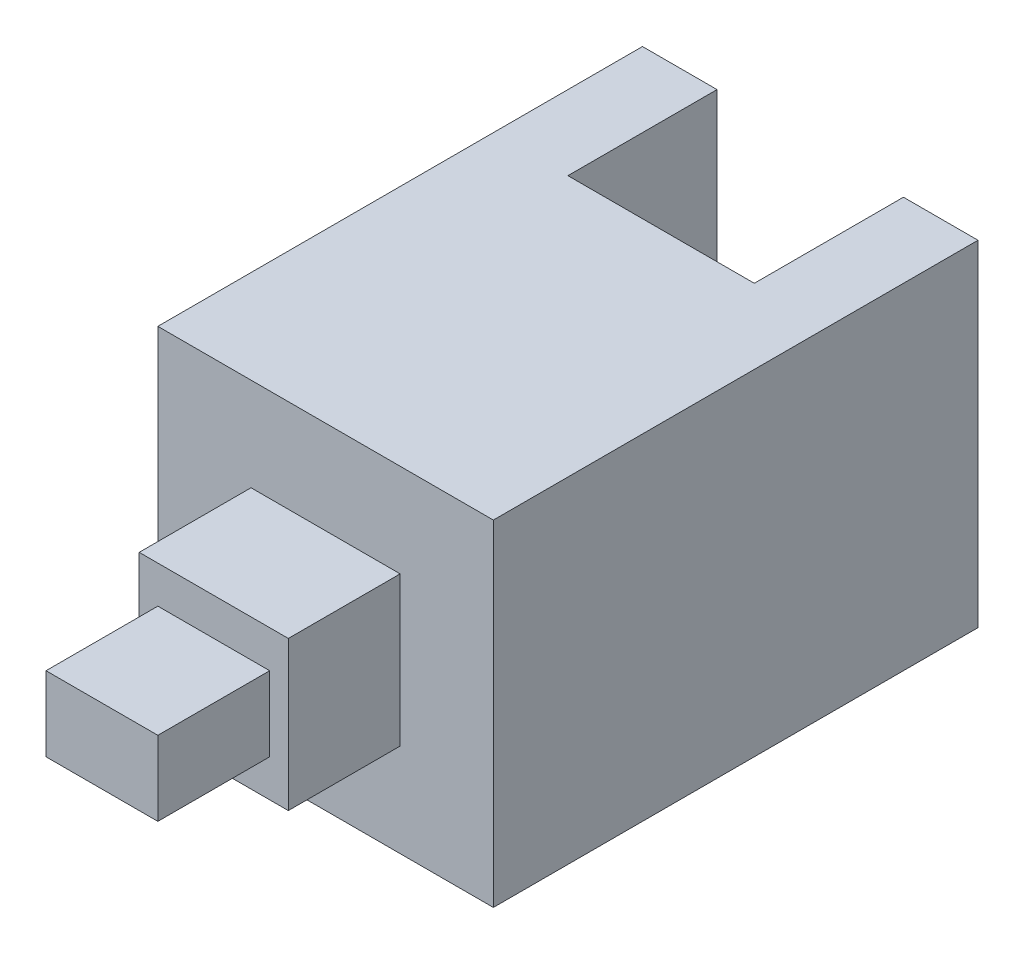
ISO-10303-21;
HEADER;
FILE_DESCRIPTION(('STEP AP214'),'2;1');
FILE_NAME('part.step','',(''),(''),'','','');
FILE_SCHEMA(('AUTOMOTIVE_DESIGN { 1 0 10303 214 1 1 1 1 }'));
ENDSEC;
DATA;
#1=APPLICATION_CONTEXT('core data for automotive mechanical design processes');
#2=APPLICATION_PROTOCOL_DEFINITION('international standard','automotive_design',2000,#1);
#3=PRODUCT_CONTEXT('',#1,'mechanical');
#4=PRODUCT('Part','Part','',(#3));
#5=PRODUCT_RELATED_PRODUCT_CATEGORY('part','',(#4));
#6=PRODUCT_DEFINITION_FORMATION('','',#4);
#7=PRODUCT_DEFINITION_CONTEXT('part definition',#1,'design');
#8=PRODUCT_DEFINITION('design','',#6,#7);
#9=PRODUCT_DEFINITION_SHAPE('','',#8);
#10=(LENGTH_UNIT() NAMED_UNIT(*) SI_UNIT(.MILLI.,.METRE.));
#11=(NAMED_UNIT(*) PLANE_ANGLE_UNIT() SI_UNIT($,.RADIAN.));
#12=(NAMED_UNIT(*) SI_UNIT($,.STERADIAN.) SOLID_ANGLE_UNIT());
#13=UNCERTAINTY_MEASURE_WITH_UNIT(LENGTH_MEASURE(1.E-05),#10,'distance_accuracy_value','');
#14=(GEOMETRIC_REPRESENTATION_CONTEXT(3) GLOBAL_UNCERTAINTY_ASSIGNED_CONTEXT((#13)) GLOBAL_UNIT_ASSIGNED_CONTEXT((#10,
#11,#12)) REPRESENTATION_CONTEXT('',''));
#15=CARTESIAN_POINT('',(0.,0.,0.));
#16=DIRECTION('',(0.,0.,1.));
#17=DIRECTION('',(1.,0.,0.));
#18=AXIS2_PLACEMENT_3D('',#15,#16,#17);
#19=CARTESIAN_POINT('',(0.,0.,0.));
#20=DIRECTION('',(0.,0.,1.));
#21=DIRECTION('',(1.,0.,0.));
#22=AXIS2_PLACEMENT_3D('',#19,#20,#21);
#23=PLANE('',#22);
#24=DIRECTION('',(0.,-1.,0.));
#25=VECTOR('',#24,1.);
#26=CARTESIAN_POINT('',(-2.5,4.5,0.));
#27=LINE('',#26,#25);
#28=CARTESIAN_POINT('',(-2.5,4.5,0.));
#29=VERTEX_POINT('',#28);
#30=CARTESIAN_POINT('',(-2.5,-4.5,0.));
#31=VERTEX_POINT('',#30);
#32=EDGE_CURVE('E177',#29,#31,#27,.T.);
#33=ORIENTED_EDGE('',*,*,#32,.F.);
#34=DIRECTION('',(-1.,0.,0.));
#35=VECTOR('',#34,1.);
#36=CARTESIAN_POINT('',(-4.5,4.5,0.));
#37=LINE('',#36,#35);
#38=CARTESIAN_POINT('',(2.5,4.5,0.));
#39=VERTEX_POINT('',#38);
#40=EDGE_CURVE('E306',#39,#29,#37,.T.);
#41=ORIENTED_EDGE('',*,*,#40,.F.);
#42=DIRECTION('',(0.,1.,0.));
#43=VECTOR('',#42,1.);
#44=CARTESIAN_POINT('',(2.5,4.5,0.));
#45=LINE('',#44,#43);
#46=CARTESIAN_POINT('',(2.5,-4.5,0.));
#47=VERTEX_POINT('',#46);
#48=EDGE_CURVE('E190',#47,#39,#45,.T.);
#49=ORIENTED_EDGE('',*,*,#48,.F.);
#50=DIRECTION('',(1.,0.,0.));
#51=VECTOR('',#50,1.);
#52=CARTESIAN_POINT('',(-4.5,-4.5,0.));
#53=LINE('',#52,#51);
#54=EDGE_CURVE('E60',#31,#47,#53,.T.);
#55=ORIENTED_EDGE('',*,*,#54,.F.);
#56=EDGE_LOOP('',(#33,#41,#49,#55));
#57=FACE_BOUND('',#56,.T.);
#58=ADVANCED_FACE('F39',(#57),#23,.F.);
#59=CARTESIAN_POINT('',(4.5,4.5,9.));
#60=DIRECTION('',(-1.,0.,0.));
#61=DIRECTION('',(0.,-1.,0.));
#62=AXIS2_PLACEMENT_3D('',#59,#60,#61);
#63=PLANE('',#62);
#64=DIRECTION('',(0.,0.,-1.));
#65=VECTOR('',#64,1.);
#66=CARTESIAN_POINT('',(4.5,-4.5,9.));
#67=LINE('',#66,#65);
#68=CARTESIAN_POINT('',(4.5,-4.5,9.));
#69=VERTEX_POINT('',#68);
#70=CARTESIAN_POINT('',(4.5,-4.5,-4.));
#71=VERTEX_POINT('',#70);
#72=EDGE_CURVE('E319',#69,#71,#67,.T.);
#73=ORIENTED_EDGE('',*,*,#72,.T.);
#74=DIRECTION('',(0.,-1.,0.));
#75=VECTOR('',#74,1.);
#76=CARTESIAN_POINT('',(4.5,4.5,-4.));
#77=LINE('',#76,#75);
#78=CARTESIAN_POINT('',(4.5,4.5,-4.));
#79=VERTEX_POINT('',#78);
#80=EDGE_CURVE('E191',#79,#71,#77,.T.);
#81=ORIENTED_EDGE('',*,*,#80,.F.);
#82=DIRECTION('',(0.,0.,-1.));
#83=VECTOR('',#82,1.);
#84=CARTESIAN_POINT('',(4.5,4.5,9.));
#85=LINE('',#84,#83);
#86=CARTESIAN_POINT('',(4.5,4.5,9.));
#87=VERTEX_POINT('',#86);
#88=EDGE_CURVE('E11',#87,#79,#85,.T.);
#89=ORIENTED_EDGE('',*,*,#88,.F.);
#90=DIRECTION('',(0.,1.,0.));
#91=VECTOR('',#90,1.);
#92=CARTESIAN_POINT('',(4.5,4.5,9.));
#93=LINE('',#92,#91);
#94=EDGE_CURVE('E307',#69,#87,#93,.T.);
#95=ORIENTED_EDGE('',*,*,#94,.F.);
#96=EDGE_LOOP('',(#73,#81,#89,#95));
#97=FACE_BOUND('',#96,.T.);
#98=ADVANCED_FACE('F41',(#97),#63,.F.);
#99=CARTESIAN_POINT('',(-4.5,4.5,9.));
#100=DIRECTION('',(0.,-1.,0.));
#101=DIRECTION('',(0.,0.,-1.));
#102=AXIS2_PLACEMENT_3D('',#99,#100,#101);
#103=PLANE('',#102);
#104=ORIENTED_EDGE('',*,*,#88,.T.);
#105=DIRECTION('',(1.,0.,0.));
#106=VECTOR('',#105,1.);
#107=CARTESIAN_POINT('',(4.5,4.5,-4.));
#108=LINE('',#107,#106);
#109=CARTESIAN_POINT('',(2.5,4.5,-4.));
#110=VERTEX_POINT('',#109);
#111=EDGE_CURVE('E201',#110,#79,#108,.T.);
#112=ORIENTED_EDGE('',*,*,#111,.F.);
#113=DIRECTION('',(0.,0.,1.));
#114=VECTOR('',#113,1.);
#115=CARTESIAN_POINT('',(2.5,4.5,-4.));
#116=LINE('',#115,#114);
#117=EDGE_CURVE('E205',#110,#39,#116,.T.);
#118=ORIENTED_EDGE('',*,*,#117,.T.);
#119=ORIENTED_EDGE('',*,*,#40,.T.);
#120=DIRECTION('',(0.,0.,1.));
#121=VECTOR('',#120,1.);
#122=CARTESIAN_POINT('',(-2.5,4.5,-4.));
#123=LINE('',#122,#121);
#124=CARTESIAN_POINT('',(-2.5,4.5,-4.));
#125=VERTEX_POINT('',#124);
#126=EDGE_CURVE('E167',#125,#29,#123,.T.);
#127=ORIENTED_EDGE('',*,*,#126,.F.);
#128=DIRECTION('',(1.,0.,0.));
#129=VECTOR('',#128,1.);
#130=CARTESIAN_POINT('',(-4.5,4.5,-4.));
#131=LINE('',#130,#129);
#132=CARTESIAN_POINT('',(-4.5,4.5,-4.));
#133=VERTEX_POINT('',#132);
#134=EDGE_CURVE('E164',#133,#125,#131,.T.);
#135=ORIENTED_EDGE('',*,*,#134,.F.);
#136=DIRECTION('',(0.,0.,-1.));
#137=VECTOR('',#136,1.);
#138=CARTESIAN_POINT('',(-4.5,4.5,9.));
#139=LINE('',#138,#137);
#140=CARTESIAN_POINT('',(-4.5,4.5,9.));
#141=VERTEX_POINT('',#140);
#142=EDGE_CURVE('E48',#141,#133,#139,.T.);
#143=ORIENTED_EDGE('',*,*,#142,.F.);
#144=DIRECTION('',(-1.,0.,0.));
#145=VECTOR('',#144,1.);
#146=CARTESIAN_POINT('',(-4.5,4.5,9.));
#147=LINE('',#146,#145);
#148=EDGE_CURVE('E311',#87,#141,#147,.T.);
#149=ORIENTED_EDGE('',*,*,#148,.F.);
#150=EDGE_LOOP('',(#104,#112,#118,#119,#127,#135,#143,#149));
#151=FACE_BOUND('',#150,.T.);
#152=ADVANCED_FACE('F165',(#151),#103,.F.);
#153=CARTESIAN_POINT('',(-4.5,4.5,9.));
#154=DIRECTION('',(1.,0.,0.));
#155=DIRECTION('',(0.,1.,0.));
#156=AXIS2_PLACEMENT_3D('',#153,#154,#155);
#157=PLANE('',#156);
#158=ORIENTED_EDGE('',*,*,#142,.T.);
#159=DIRECTION('',(0.,1.,0.));
#160=VECTOR('',#159,1.);
#161=CARTESIAN_POINT('',(-4.5,4.5,-4.));
#162=LINE('',#161,#160);
#163=CARTESIAN_POINT('',(-4.5,-4.5,-4.));
#164=VERTEX_POINT('',#163);
#165=EDGE_CURVE('E158',#164,#133,#162,.T.);
#166=ORIENTED_EDGE('',*,*,#165,.F.);
#167=DIRECTION('',(0.,0.,-1.));
#168=VECTOR('',#167,1.);
#169=CARTESIAN_POINT('',(-4.5,-4.5,9.));
#170=LINE('',#169,#168);
#171=CARTESIAN_POINT('',(-4.5,-4.5,9.));
#172=VERTEX_POINT('',#171);
#173=EDGE_CURVE('E162',#172,#164,#170,.T.);
#174=ORIENTED_EDGE('',*,*,#173,.F.);
#175=DIRECTION('',(0.,-1.,0.));
#176=VECTOR('',#175,1.);
#177=CARTESIAN_POINT('',(-4.5,4.5,9.));
#178=LINE('',#177,#176);
#179=EDGE_CURVE('E159',#141,#172,#178,.T.);
#180=ORIENTED_EDGE('',*,*,#179,.F.);
#181=EDGE_LOOP('',(#158,#166,#174,#180));
#182=FACE_BOUND('',#181,.T.);
#183=ADVANCED_FACE('F155',(#182),#157,.F.);
#184=CARTESIAN_POINT('',(-4.5,-4.5,9.));
#185=DIRECTION('',(0.,1.,0.));
#186=DIRECTION('',(0.,0.,1.));
#187=AXIS2_PLACEMENT_3D('',#184,#185,#186);
#188=PLANE('',#187);
#189=ORIENTED_EDGE('',*,*,#173,.T.);
#190=DIRECTION('',(-1.,0.,0.));
#191=VECTOR('',#190,1.);
#192=CARTESIAN_POINT('',(-4.5,-4.5,-4.));
#193=LINE('',#192,#191);
#194=CARTESIAN_POINT('',(-2.5,-4.5,-4.));
#195=VERTEX_POINT('',#194);
#196=EDGE_CURVE('E175',#195,#164,#193,.T.);
#197=ORIENTED_EDGE('',*,*,#196,.F.);
#198=DIRECTION('',(0.,0.,1.));
#199=VECTOR('',#198,1.);
#200=CARTESIAN_POINT('',(-2.5,-4.5,-4.));
#201=LINE('',#200,#199);
#202=EDGE_CURVE('E55',#195,#31,#201,.T.);
#203=ORIENTED_EDGE('',*,*,#202,.T.);
#204=ORIENTED_EDGE('',*,*,#54,.T.);
#205=DIRECTION('',(0.,0.,1.));
#206=VECTOR('',#205,1.);
#207=CARTESIAN_POINT('',(2.5,-4.5,-4.));
#208=LINE('',#207,#206);
#209=CARTESIAN_POINT('',(2.5,-4.5,-4.));
#210=VERTEX_POINT('',#209);
#211=EDGE_CURVE('E212',#210,#47,#208,.T.);
#212=ORIENTED_EDGE('',*,*,#211,.F.);
#213=DIRECTION('',(-1.,0.,0.));
#214=VECTOR('',#213,1.);
#215=CARTESIAN_POINT('',(4.5,-4.5,-4.));
#216=LINE('',#215,#214);
#217=EDGE_CURVE('E195',#71,#210,#216,.T.);
#218=ORIENTED_EDGE('',*,*,#217,.F.);
#219=ORIENTED_EDGE('',*,*,#72,.F.);
#220=DIRECTION('',(1.,0.,0.));
#221=VECTOR('',#220,1.);
#222=CARTESIAN_POINT('',(-4.5,-4.5,9.));
#223=LINE('',#222,#221);
#224=EDGE_CURVE('E316',#172,#69,#223,.T.);
#225=ORIENTED_EDGE('',*,*,#224,.F.);
#226=EDGE_LOOP('',(#189,#197,#203,#204,#212,#218,#219,#225));
#227=FACE_BOUND('',#226,.T.);
#228=ADVANCED_FACE('F328',(#227),#188,.F.);
#229=CARTESIAN_POINT('',(0.,0.,9.));
#230=DIRECTION('',(0.,0.,1.));
#231=DIRECTION('',(1.,0.,0.));
#232=AXIS2_PLACEMENT_3D('',#229,#230,#231);
#233=PLANE('',#232);
#234=DIRECTION('',(0.,1.,0.));
#235=VECTOR('',#234,1.);
#236=CARTESIAN_POINT('',(2.,2.,9.));
#237=LINE('',#236,#235);
#238=CARTESIAN_POINT('',(2.,-2.,9.));
#239=VERTEX_POINT('',#238);
#240=CARTESIAN_POINT('',(2.,2.,9.));
#241=VERTEX_POINT('',#240);
#242=EDGE_CURVE('E261',#239,#241,#237,.T.);
#243=ORIENTED_EDGE('',*,*,#242,.F.);
#244=DIRECTION('',(1.,0.,0.));
#245=VECTOR('',#244,1.);
#246=CARTESIAN_POINT('',(-2.,-2.,9.));
#247=LINE('',#246,#245);
#248=CARTESIAN_POINT('',(-2.,-2.,9.));
#249=VERTEX_POINT('',#248);
#250=EDGE_CURVE('E267',#249,#239,#247,.T.);
#251=ORIENTED_EDGE('',*,*,#250,.F.);
#252=DIRECTION('',(0.,-1.,0.));
#253=VECTOR('',#252,1.);
#254=CARTESIAN_POINT('',(-2.,2.,9.));
#255=LINE('',#254,#253);
#256=CARTESIAN_POINT('',(-2.,2.,9.));
#257=VERTEX_POINT('',#256);
#258=EDGE_CURVE('E284',#257,#249,#255,.T.);
#259=ORIENTED_EDGE('',*,*,#258,.F.);
#260=DIRECTION('',(-1.,0.,0.));
#261=VECTOR('',#260,1.);
#262=CARTESIAN_POINT('',(-2.,2.,9.));
#263=LINE('',#262,#261);
#264=EDGE_CURVE('E280',#241,#257,#263,.T.);
#265=ORIENTED_EDGE('',*,*,#264,.F.);
#266=EDGE_LOOP('',(#243,#251,#259,#265));
#267=FACE_BOUND('',#266,.T.);
#268=ORIENTED_EDGE('',*,*,#94,.T.);
#269=ORIENTED_EDGE('',*,*,#148,.T.);
#270=ORIENTED_EDGE('',*,*,#179,.T.);
#271=ORIENTED_EDGE('',*,*,#224,.T.);
#272=EDGE_LOOP('',(#268,#269,#270,#271));
#273=FACE_BOUND('',#272,.T.);
#274=ADVANCED_FACE('F333',(#267,#273),#233,.T.);
#275=CARTESIAN_POINT('',(2.,2.,12.));
#276=DIRECTION('',(-1.,0.,0.));
#277=DIRECTION('',(0.,-1.,0.));
#278=AXIS2_PLACEMENT_3D('',#275,#276,#277);
#279=PLANE('',#278);
#280=ORIENTED_EDGE('',*,*,#242,.T.);
#281=DIRECTION('',(0.,0.,-1.));
#282=VECTOR('',#281,1.);
#283=CARTESIAN_POINT('',(2.,2.,12.));
#284=LINE('',#283,#282);
#285=CARTESIAN_POINT('',(2.,2.,12.));
#286=VERTEX_POINT('',#285);
#287=EDGE_CURVE('E302',#286,#241,#284,.T.);
#288=ORIENTED_EDGE('',*,*,#287,.F.);
#289=DIRECTION('',(0.,1.,0.));
#290=VECTOR('',#289,1.);
#291=CARTESIAN_POINT('',(2.,2.,12.));
#292=LINE('',#291,#290);
#293=CARTESIAN_POINT('',(2.,-2.,12.));
#294=VERTEX_POINT('',#293);
#295=EDGE_CURVE('E262',#294,#286,#292,.T.);
#296=ORIENTED_EDGE('',*,*,#295,.F.);
#297=DIRECTION('',(0.,0.,-1.));
#298=VECTOR('',#297,1.);
#299=CARTESIAN_POINT('',(2.,-2.,12.));
#300=LINE('',#299,#298);
#301=EDGE_CURVE('E276',#294,#239,#300,.T.);
#302=ORIENTED_EDGE('',*,*,#301,.T.);
#303=EDGE_LOOP('',(#280,#288,#296,#302));
#304=FACE_BOUND('',#303,.T.);
#305=ADVANCED_FACE('F387',(#304),#279,.F.);
#306=CARTESIAN_POINT('',(-2.,2.,12.));
#307=DIRECTION('',(0.,-1.,0.));
#308=DIRECTION('',(0.,0.,-1.));
#309=AXIS2_PLACEMENT_3D('',#306,#307,#308);
#310=PLANE('',#309);
#311=ORIENTED_EDGE('',*,*,#264,.T.);
#312=DIRECTION('',(0.,0.,-1.));
#313=VECTOR('',#312,1.);
#314=CARTESIAN_POINT('',(-2.,2.,12.));
#315=LINE('',#314,#313);
#316=CARTESIAN_POINT('',(-2.,2.,12.));
#317=VERTEX_POINT('',#316);
#318=EDGE_CURVE('E298',#317,#257,#315,.T.);
#319=ORIENTED_EDGE('',*,*,#318,.F.);
#320=DIRECTION('',(-1.,0.,0.));
#321=VECTOR('',#320,1.);
#322=CARTESIAN_POINT('',(-2.,2.,12.));
#323=LINE('',#322,#321);
#324=EDGE_CURVE('E266',#286,#317,#323,.T.);
#325=ORIENTED_EDGE('',*,*,#324,.F.);
#326=ORIENTED_EDGE('',*,*,#287,.T.);
#327=EDGE_LOOP('',(#311,#319,#325,#326));
#328=FACE_BOUND('',#327,.T.);
#329=ADVANCED_FACE('F394',(#328),#310,.F.);
#330=CARTESIAN_POINT('',(-2.,2.,12.));
#331=DIRECTION('',(1.,0.,0.));
#332=DIRECTION('',(0.,1.,0.));
#333=AXIS2_PLACEMENT_3D('',#330,#331,#332);
#334=PLANE('',#333);
#335=ORIENTED_EDGE('',*,*,#258,.T.);
#336=DIRECTION('',(0.,0.,-1.));
#337=VECTOR('',#336,1.);
#338=CARTESIAN_POINT('',(-2.,-2.,12.));
#339=LINE('',#338,#337);
#340=CARTESIAN_POINT('',(-2.,-2.,12.));
#341=VERTEX_POINT('',#340);
#342=EDGE_CURVE('E294',#341,#249,#339,.T.);
#343=ORIENTED_EDGE('',*,*,#342,.F.);
#344=DIRECTION('',(0.,-1.,0.));
#345=VECTOR('',#344,1.);
#346=CARTESIAN_POINT('',(-2.,2.,12.));
#347=LINE('',#346,#345);
#348=EDGE_CURVE('E270',#317,#341,#347,.T.);
#349=ORIENTED_EDGE('',*,*,#348,.F.);
#350=ORIENTED_EDGE('',*,*,#318,.T.);
#351=EDGE_LOOP('',(#335,#343,#349,#350));
#352=FACE_BOUND('',#351,.T.);
#353=ADVANCED_FACE('F401',(#352),#334,.F.);
#354=CARTESIAN_POINT('',(-2.,-2.,12.));
#355=DIRECTION('',(0.,1.,0.));
#356=DIRECTION('',(0.,0.,1.));
#357=AXIS2_PLACEMENT_3D('',#354,#355,#356);
#358=PLANE('',#357);
#359=ORIENTED_EDGE('',*,*,#250,.T.);
#360=ORIENTED_EDGE('',*,*,#301,.F.);
#361=DIRECTION('',(1.,0.,0.));
#362=VECTOR('',#361,1.);
#363=CARTESIAN_POINT('',(-2.,-2.,12.));
#364=LINE('',#363,#362);
#365=EDGE_CURVE('E273',#341,#294,#364,.T.);
#366=ORIENTED_EDGE('',*,*,#365,.F.);
#367=ORIENTED_EDGE('',*,*,#342,.T.);
#368=EDGE_LOOP('',(#359,#360,#366,#367));
#369=FACE_BOUND('',#368,.T.);
#370=ADVANCED_FACE('F409',(#369),#358,.F.);
#371=CARTESIAN_POINT('',(0.,0.,12.));
#372=DIRECTION('',(0.,0.,1.));
#373=DIRECTION('',(1.,0.,0.));
#374=AXIS2_PLACEMENT_3D('',#371,#372,#373);
#375=PLANE('',#374);
#376=DIRECTION('',(0.,-1.,0.));
#377=VECTOR('',#376,1.);
#378=CARTESIAN_POINT('',(-1.5,1.,12.));
#379=LINE('',#378,#377);
#380=CARTESIAN_POINT('',(-1.5,1.,12.));
#381=VERTEX_POINT('',#380);
#382=CARTESIAN_POINT('',(-1.5,-1.,12.));
#383=VERTEX_POINT('',#382);
#384=EDGE_CURVE('E216',#381,#383,#379,.T.);
#385=ORIENTED_EDGE('',*,*,#384,.F.);
#386=DIRECTION('',(-1.,0.,0.));
#387=VECTOR('',#386,1.);
#388=CARTESIAN_POINT('',(-1.5,1.,12.));
#389=LINE('',#388,#387);
#390=CARTESIAN_POINT('',(1.5,1.,12.));
#391=VERTEX_POINT('',#390);
#392=EDGE_CURVE('E222',#391,#381,#389,.T.);
#393=ORIENTED_EDGE('',*,*,#392,.F.);
#394=DIRECTION('',(0.,1.,0.));
#395=VECTOR('',#394,1.);
#396=CARTESIAN_POINT('',(1.5,1.,12.));
#397=LINE('',#396,#395);
#398=CARTESIAN_POINT('',(1.5,-1.,12.));
#399=VERTEX_POINT('',#398);
#400=EDGE_CURVE('E239',#399,#391,#397,.T.);
#401=ORIENTED_EDGE('',*,*,#400,.F.);
#402=DIRECTION('',(1.,0.,0.));
#403=VECTOR('',#402,1.);
#404=CARTESIAN_POINT('',(-1.5,-1.,12.));
#405=LINE('',#404,#403);
#406=EDGE_CURVE('E235',#383,#399,#405,.T.);
#407=ORIENTED_EDGE('',*,*,#406,.F.);
#408=EDGE_LOOP('',(#385,#393,#401,#407));
#409=FACE_BOUND('',#408,.T.);
#410=ORIENTED_EDGE('',*,*,#295,.T.);
#411=ORIENTED_EDGE('',*,*,#324,.T.);
#412=ORIENTED_EDGE('',*,*,#348,.T.);
#413=ORIENTED_EDGE('',*,*,#365,.T.);
#414=EDGE_LOOP('',(#410,#411,#412,#413));
#415=FACE_BOUND('',#414,.T.);
#416=ADVANCED_FACE('F417',(#409,#415),#375,.T.);
#417=CARTESIAN_POINT('',(-1.5,1.,15.));
#418=DIRECTION('',(1.,0.,0.));
#419=DIRECTION('',(0.,1.,0.));
#420=AXIS2_PLACEMENT_3D('',#417,#418,#419);
#421=PLANE('',#420);
#422=ORIENTED_EDGE('',*,*,#384,.T.);
#423=DIRECTION('',(0.,0.,-1.));
#424=VECTOR('',#423,1.);
#425=CARTESIAN_POINT('',(-1.5,-1.,15.));
#426=LINE('',#425,#424);
#427=CARTESIAN_POINT('',(-1.5,-1.,15.));
#428=VERTEX_POINT('',#427);
#429=EDGE_CURVE('E257',#428,#383,#426,.T.);
#430=ORIENTED_EDGE('',*,*,#429,.F.);
#431=DIRECTION('',(0.,-1.,0.));
#432=VECTOR('',#431,1.);
#433=CARTESIAN_POINT('',(-1.5,1.,15.));
#434=LINE('',#433,#432);
#435=CARTESIAN_POINT('',(-1.5,1.,15.));
#436=VERTEX_POINT('',#435);
#437=EDGE_CURVE('E217',#436,#428,#434,.T.);
#438=ORIENTED_EDGE('',*,*,#437,.F.);
#439=DIRECTION('',(0.,0.,-1.));
#440=VECTOR('',#439,1.);
#441=CARTESIAN_POINT('',(-1.5,1.,15.));
#442=LINE('',#441,#440);
#443=EDGE_CURVE('E231',#436,#381,#442,.T.);
#444=ORIENTED_EDGE('',*,*,#443,.T.);
#445=EDGE_LOOP('',(#422,#430,#438,#444));
#446=FACE_BOUND('',#445,.T.);
#447=ADVANCED_FACE('F425',(#446),#421,.F.);
#448=CARTESIAN_POINT('',(-1.5,-1.,15.));
#449=DIRECTION('',(0.,1.,0.));
#450=DIRECTION('',(0.,0.,1.));
#451=AXIS2_PLACEMENT_3D('',#448,#449,#450);
#452=PLANE('',#451);
#453=ORIENTED_EDGE('',*,*,#406,.T.);
#454=DIRECTION('',(0.,0.,-1.));
#455=VECTOR('',#454,1.);
#456=CARTESIAN_POINT('',(1.5,-1.,15.));
#457=LINE('',#456,#455);
#458=CARTESIAN_POINT('',(1.5,-1.,15.));
#459=VERTEX_POINT('',#458);
#460=EDGE_CURVE('E253',#459,#399,#457,.T.);
#461=ORIENTED_EDGE('',*,*,#460,.F.);
#462=DIRECTION('',(1.,0.,0.));
#463=VECTOR('',#462,1.);
#464=CARTESIAN_POINT('',(-1.5,-1.,15.));
#465=LINE('',#464,#463);
#466=EDGE_CURVE('E221',#428,#459,#465,.T.);
#467=ORIENTED_EDGE('',*,*,#466,.F.);
#468=ORIENTED_EDGE('',*,*,#429,.T.);
#469=EDGE_LOOP('',(#453,#461,#467,#468));
#470=FACE_BOUND('',#469,.T.);
#471=ADVANCED_FACE('F433',(#470),#452,.F.);
#472=CARTESIAN_POINT('',(1.5,1.,15.));
#473=DIRECTION('',(-1.,0.,0.));
#474=DIRECTION('',(0.,0.,1.));
#475=AXIS2_PLACEMENT_3D('',#472,#473,#474);
#476=PLANE('',#475);
#477=ORIENTED_EDGE('',*,*,#400,.T.);
#478=DIRECTION('',(0.,0.,-1.));
#479=VECTOR('',#478,1.);
#480=CARTESIAN_POINT('',(1.5,1.,15.));
#481=LINE('',#480,#479);
#482=CARTESIAN_POINT('',(1.5,1.,15.));
#483=VERTEX_POINT('',#482);
#484=EDGE_CURVE('E249',#483,#391,#481,.T.);
#485=ORIENTED_EDGE('',*,*,#484,.F.);
#486=DIRECTION('',(0.,1.,0.));
#487=VECTOR('',#486,1.);
#488=CARTESIAN_POINT('',(1.5,1.,15.));
#489=LINE('',#488,#487);
#490=EDGE_CURVE('E225',#459,#483,#489,.T.);
#491=ORIENTED_EDGE('',*,*,#490,.F.);
#492=ORIENTED_EDGE('',*,*,#460,.T.);
#493=EDGE_LOOP('',(#477,#485,#491,#492));
#494=FACE_BOUND('',#493,.T.);
#495=ADVANCED_FACE('F441',(#494),#476,.F.);
#496=CARTESIAN_POINT('',(-1.5,1.,15.));
#497=DIRECTION('',(0.,-1.,0.));
#498=DIRECTION('',(0.,0.,-1.));
#499=AXIS2_PLACEMENT_3D('',#496,#497,#498);
#500=PLANE('',#499);
#501=ORIENTED_EDGE('',*,*,#392,.T.);
#502=ORIENTED_EDGE('',*,*,#443,.F.);
#503=DIRECTION('',(-1.,0.,0.));
#504=VECTOR('',#503,1.);
#505=CARTESIAN_POINT('',(-1.5,1.,15.));
#506=LINE('',#505,#504);
#507=EDGE_CURVE('E228',#483,#436,#506,.T.);
#508=ORIENTED_EDGE('',*,*,#507,.F.);
#509=ORIENTED_EDGE('',*,*,#484,.T.);
#510=EDGE_LOOP('',(#501,#502,#508,#509));
#511=FACE_BOUND('',#510,.T.);
#512=ADVANCED_FACE('F449',(#511),#500,.F.);
#513=CARTESIAN_POINT('',(0.,0.,15.));
#514=DIRECTION('',(0.,0.,1.));
#515=DIRECTION('',(1.,0.,0.));
#516=AXIS2_PLACEMENT_3D('',#513,#514,#515);
#517=PLANE('',#516);
#518=ORIENTED_EDGE('',*,*,#437,.T.);
#519=ORIENTED_EDGE('',*,*,#466,.T.);
#520=ORIENTED_EDGE('',*,*,#490,.T.);
#521=ORIENTED_EDGE('',*,*,#507,.T.);
#522=EDGE_LOOP('',(#518,#519,#520,#521));
#523=FACE_BOUND('',#522,.T.);
#524=ADVANCED_FACE('F457',(#523),#517,.T.);
#525=CARTESIAN_POINT('',(2.5,4.5,-4.));
#526=DIRECTION('',(1.,0.,0.));
#527=DIRECTION('',(0.,1.,0.));
#528=AXIS2_PLACEMENT_3D('',#525,#526,#527);
#529=PLANE('',#528);
#530=ORIENTED_EDGE('',*,*,#48,.T.);
#531=ORIENTED_EDGE('',*,*,#117,.F.);
#532=DIRECTION('',(0.,1.,0.));
#533=VECTOR('',#532,1.);
#534=CARTESIAN_POINT('',(2.5,4.5,-4.));
#535=LINE('',#534,#533);
#536=EDGE_CURVE('E198',#210,#110,#535,.T.);
#537=ORIENTED_EDGE('',*,*,#536,.F.);
#538=ORIENTED_EDGE('',*,*,#211,.T.);
#539=EDGE_LOOP('',(#530,#531,#537,#538));
#540=FACE_BOUND('',#539,.T.);
#541=ADVANCED_FACE('F343',(#540),#529,.F.);
#542=CARTESIAN_POINT('',(0.,0.,-4.));
#543=DIRECTION('',(0.,0.,-1.));
#544=DIRECTION('',(-1.,0.,0.));
#545=AXIS2_PLACEMENT_3D('',#542,#543,#544);
#546=PLANE('',#545);
#547=ORIENTED_EDGE('',*,*,#80,.T.);
#548=ORIENTED_EDGE('',*,*,#217,.T.);
#549=ORIENTED_EDGE('',*,*,#536,.T.);
#550=ORIENTED_EDGE('',*,*,#111,.T.);
#551=EDGE_LOOP('',(#547,#548,#549,#550));
#552=FACE_BOUND('',#551,.T.);
#553=ADVANCED_FACE('F339',(#552),#546,.T.);
#554=CARTESIAN_POINT('',(-2.5,4.5,-4.));
#555=DIRECTION('',(-1.,0.,0.));
#556=DIRECTION('',(0.,-1.,0.));
#557=AXIS2_PLACEMENT_3D('',#554,#555,#556);
#558=PLANE('',#557);
#559=ORIENTED_EDGE('',*,*,#32,.T.);
#560=ORIENTED_EDGE('',*,*,#202,.F.);
#561=DIRECTION('',(0.,-1.,0.));
#562=VECTOR('',#561,1.);
#563=CARTESIAN_POINT('',(-2.5,4.5,-4.));
#564=LINE('',#563,#562);
#565=EDGE_CURVE('E171',#125,#195,#564,.T.);
#566=ORIENTED_EDGE('',*,*,#565,.F.);
#567=ORIENTED_EDGE('',*,*,#126,.T.);
#568=EDGE_LOOP('',(#559,#560,#566,#567));
#569=FACE_BOUND('',#568,.T.);
#570=ADVANCED_FACE('F347',(#569),#558,.F.);
#571=CARTESIAN_POINT('',(0.,0.,-4.));
#572=DIRECTION('',(0.,0.,1.));
#573=DIRECTION('',(1.,0.,0.));
#574=AXIS2_PLACEMENT_3D('',#571,#572,#573);
#575=PLANE('',#574);
#576=ORIENTED_EDGE('',*,*,#165,.T.);
#577=ORIENTED_EDGE('',*,*,#134,.T.);
#578=ORIENTED_EDGE('',*,*,#565,.T.);
#579=ORIENTED_EDGE('',*,*,#196,.T.);
#580=EDGE_LOOP('',(#576,#577,#578,#579));
#581=FACE_BOUND('',#580,.T.);
#582=ADVANCED_FACE('F174',(#581),#575,.F.);
#583=CLOSED_SHELL('',(#58,#98,#152,#183,#228,#274,#305,#329,#353,#370,#416,#447,#471,#495,#512,
#524,#541,#553,#570,#582));
#584=MANIFOLD_SOLID_BREP('B2',#583);
#585=ADVANCED_BREP_SHAPE_REPRESENTATION('',(#18,#584),#14);
#586=SHAPE_DEFINITION_REPRESENTATION(#9,#585);
ENDSEC;
END-ISO-10303-21;
